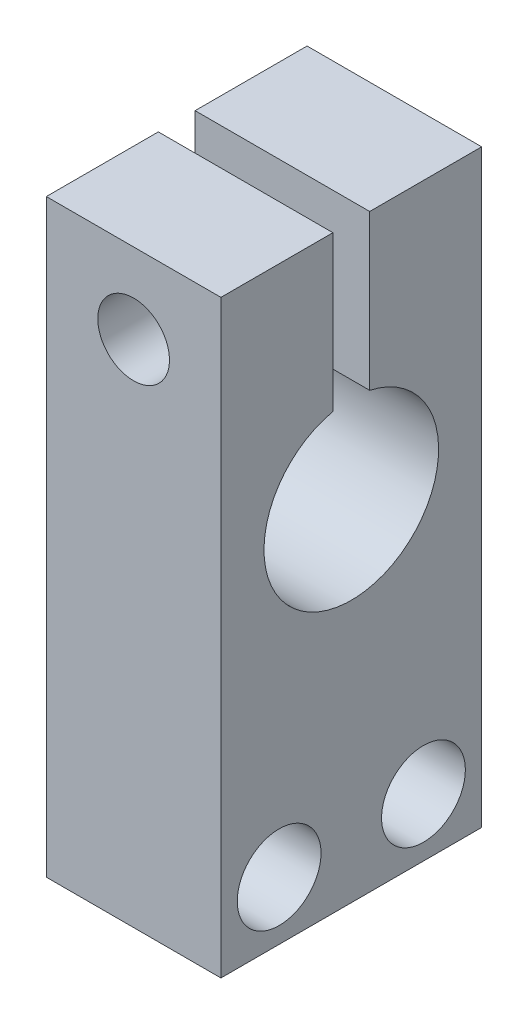
ISO-10303-21;
HEADER;
FILE_DESCRIPTION(('STEP AP214'),'2;1');
FILE_NAME('part.step','',(''),(''),'','','');
FILE_SCHEMA(('AUTOMOTIVE_DESIGN { 1 0 10303 214 1 1 1 1 }'));
ENDSEC;
DATA;
#1=APPLICATION_CONTEXT('core data for automotive mechanical design processes');
#2=APPLICATION_PROTOCOL_DEFINITION('international standard','automotive_design',2000,#1);
#3=PRODUCT_CONTEXT('',#1,'mechanical');
#4=PRODUCT('Part','Part','',(#3));
#5=PRODUCT_RELATED_PRODUCT_CATEGORY('part','',(#4));
#6=PRODUCT_DEFINITION_FORMATION('','',#4);
#7=PRODUCT_DEFINITION_CONTEXT('part definition',#1,'design');
#8=PRODUCT_DEFINITION('design','',#6,#7);
#9=PRODUCT_DEFINITION_SHAPE('','',#8);
#10=(LENGTH_UNIT() NAMED_UNIT(*) SI_UNIT(.MILLI.,.METRE.));
#11=(NAMED_UNIT(*) PLANE_ANGLE_UNIT() SI_UNIT($,.RADIAN.));
#12=(NAMED_UNIT(*) SI_UNIT($,.STERADIAN.) SOLID_ANGLE_UNIT());
#13=UNCERTAINTY_MEASURE_WITH_UNIT(LENGTH_MEASURE(1.E-05),#10,'distance_accuracy_value','');
#14=(GEOMETRIC_REPRESENTATION_CONTEXT(3) GLOBAL_UNCERTAINTY_ASSIGNED_CONTEXT((#13)) GLOBAL_UNIT_ASSIGNED_CONTEXT((#10,
#11,#12)) REPRESENTATION_CONTEXT('',''));
#15=CARTESIAN_POINT('',(0.,0.,0.));
#16=DIRECTION('',(0.,0.,1.));
#17=DIRECTION('',(1.,0.,0.));
#18=AXIS2_PLACEMENT_3D('',#15,#16,#17);
#19=CARTESIAN_POINT('',(-4.7625,13.1064,-15.875));
#20=DIRECTION('',(0.,1.,0.));
#21=DIRECTION('',(0.,0.,1.));
#22=AXIS2_PLACEMENT_3D('',#19,#20,#21);
#23=PLANE('',#22);
#24=DIRECTION('',(-1.,0.,0.));
#25=VECTOR('',#24,1.);
#26=CARTESIAN_POINT('',(4.7625,13.1064,7.112));
#27=LINE('',#26,#25);
#28=CARTESIAN_POINT('',(4.7625,13.1064,7.112));
#29=VERTEX_POINT('',#28);
#30=CARTESIAN_POINT('',(-4.7625,13.1064,7.112));
#31=VERTEX_POINT('',#30);
#32=EDGE_CURVE('E200',#29,#31,#27,.T.);
#33=ORIENTED_EDGE('',*,*,#32,.F.);
#34=DIRECTION('',(0.,0.,1.));
#35=VECTOR('',#34,1.);
#36=CARTESIAN_POINT('',(4.7625,13.1064,-15.875));
#37=LINE('',#36,#35);
#38=CARTESIAN_POINT('',(4.7625,13.1064,1.0033));
#39=VERTEX_POINT('',#38);
#40=EDGE_CURVE('E170',#39,#29,#37,.T.);
#41=ORIENTED_EDGE('',*,*,#40,.F.);
#42=DIRECTION('',(-1.,0.,0.));
#43=VECTOR('',#42,1.);
#44=CARTESIAN_POINT('',(4.7625,13.1064,1.0033));
#45=LINE('',#44,#43);
#46=CARTESIAN_POINT('',(-4.7625,13.1064,1.0033));
#47=VERTEX_POINT('',#46);
#48=EDGE_CURVE('E129',#39,#47,#45,.T.);
#49=ORIENTED_EDGE('',*,*,#48,.T.);
#50=DIRECTION('',(0.,0.,1.));
#51=VECTOR('',#50,1.);
#52=CARTESIAN_POINT('',(-4.7625,13.1064,-15.875));
#53=LINE('',#52,#51);
#54=EDGE_CURVE('E48',#47,#31,#53,.T.);
#55=ORIENTED_EDGE('',*,*,#54,.T.);
#56=EDGE_LOOP('',(#33,#41,#49,#55));
#57=FACE_BOUND('',#56,.T.);
#58=ADVANCED_FACE('F38',(#57),#23,.T.);
#59=CARTESIAN_POINT('',(-4.7625,-19.05,15.875));
#60=DIRECTION('',(0.,-1.,0.));
#61=DIRECTION('',(0.,0.,-1.));
#62=AXIS2_PLACEMENT_3D('',#59,#60,#61);
#63=PLANE('',#62);
#64=DIRECTION('',(1.,0.,0.));
#65=VECTOR('',#64,1.);
#66=CARTESIAN_POINT('',(-4.7625,-19.05,7.112));
#67=LINE('',#66,#65);
#68=CARTESIAN_POINT('',(-4.7625,-19.05,7.112));
#69=VERTEX_POINT('',#68);
#70=CARTESIAN_POINT('',(4.7625,-19.05,7.112));
#71=VERTEX_POINT('',#70);
#72=EDGE_CURVE('E56',#69,#71,#67,.T.);
#73=ORIENTED_EDGE('',*,*,#72,.F.);
#74=DIRECTION('',(0.,0.,-1.));
#75=VECTOR('',#74,1.);
#76=CARTESIAN_POINT('',(-4.7625,-19.05,15.875));
#77=LINE('',#76,#75);
#78=CARTESIAN_POINT('',(-4.7625,-19.05,-7.112));
#79=VERTEX_POINT('',#78);
#80=EDGE_CURVE('E167',#69,#79,#77,.T.);
#81=ORIENTED_EDGE('',*,*,#80,.T.);
#82=DIRECTION('',(-1.,0.,0.));
#83=VECTOR('',#82,1.);
#84=CARTESIAN_POINT('',(4.7625,-19.05,-7.112));
#85=LINE('',#84,#83);
#86=CARTESIAN_POINT('',(4.7625,-19.05,-7.112));
#87=VERTEX_POINT('',#86);
#88=EDGE_CURVE('E156',#87,#79,#85,.T.);
#89=ORIENTED_EDGE('',*,*,#88,.F.);
#90=DIRECTION('',(0.,0.,-1.));
#91=VECTOR('',#90,1.);
#92=CARTESIAN_POINT('',(4.7625,-19.05,15.875));
#93=LINE('',#92,#91);
#94=EDGE_CURVE('E163',#71,#87,#93,.T.);
#95=ORIENTED_EDGE('',*,*,#94,.F.);
#96=EDGE_LOOP('',(#73,#81,#89,#95));
#97=FACE_BOUND('',#96,.T.);
#98=ADVANCED_FACE('F40',(#97),#63,.T.);
#99=DIRECTION('',(-1.,0.,0.));
#100=VECTOR('',#99,1.);
#101=CARTESIAN_POINT('',(4.7625,13.1064,-1.0033));
#102=LINE('',#101,#100);
#103=CARTESIAN_POINT('',(4.7625,13.1064,-1.0033));
#104=VERTEX_POINT('',#103);
#105=CARTESIAN_POINT('',(-4.7625,13.1064,-1.0033));
#106=VERTEX_POINT('',#105);
#107=EDGE_CURVE('E147',#104,#106,#102,.T.);
#108=ORIENTED_EDGE('',*,*,#107,.F.);
#109=CARTESIAN_POINT('',(4.7625,13.1064,-7.112));
#110=VERTEX_POINT('',#109);
#111=EDGE_CURVE('E42',#110,#104,#37,.T.);
#112=ORIENTED_EDGE('',*,*,#111,.F.);
#113=DIRECTION('',(-1.,0.,0.));
#114=VECTOR('',#113,1.);
#115=CARTESIAN_POINT('',(4.7625,13.1064,-7.112));
#116=LINE('',#115,#114);
#117=CARTESIAN_POINT('',(-4.7625,13.1064,-7.112));
#118=VERTEX_POINT('',#117);
#119=EDGE_CURVE('E159',#110,#118,#116,.T.);
#120=ORIENTED_EDGE('',*,*,#119,.T.);
#121=EDGE_CURVE('E11',#118,#106,#53,.T.);
#122=ORIENTED_EDGE('',*,*,#121,.T.);
#123=EDGE_LOOP('',(#108,#112,#120,#122));
#124=FACE_BOUND('',#123,.T.);
#125=ADVANCED_FACE('F181',(#124),#23,.T.);
#126=CARTESIAN_POINT('',(-4.7625,0.,0.));
#127=DIRECTION('',(1.,0.,0.));
#128=DIRECTION('',(0.,0.,-1.));
#129=AXIS2_PLACEMENT_3D('',#126,#127,#128);
#130=PLANE('',#129);
#131=CARTESIAN_POINT('',(-4.7625,-15.875,-3.937));
#132=DIRECTION('',(1.,0.,0.));
#133=DIRECTION('',(0.,0.,-1.));
#134=AXIS2_PLACEMENT_3D('',#131,#132,#133);
#135=CIRCLE('',#134,2.286);
#136=CARTESIAN_POINT('',(-4.7625,-15.875,-6.223));
#137=VERTEX_POINT('',#136);
#138=EDGE_CURVE('E275',#137,#137,#135,.T.);
#139=ORIENTED_EDGE('',*,*,#138,.T.);
#140=EDGE_LOOP('',(#139));
#141=FACE_BOUND('',#140,.T.);
#142=CARTESIAN_POINT('',(-4.7625,-15.875,3.937));
#143=DIRECTION('',(1.,0.,0.));
#144=DIRECTION('',(0.,0.,-1.));
#145=AXIS2_PLACEMENT_3D('',#142,#143,#144);
#146=CIRCLE('',#145,2.286);
#147=CARTESIAN_POINT('',(-4.7625,-15.875,1.651));
#148=VERTEX_POINT('',#147);
#149=EDGE_CURVE('E289',#148,#148,#146,.T.);
#150=ORIENTED_EDGE('',*,*,#149,.T.);
#151=EDGE_LOOP('',(#150));
#152=FACE_BOUND('',#151,.T.);
#153=DIRECTION('',(0.,1.,0.));
#154=VECTOR('',#153,1.);
#155=CARTESIAN_POINT('',(-4.7625,4.65561976110591,1.0033));
#156=LINE('',#155,#154);
#157=CARTESIAN_POINT('',(-4.7625,4.65561976110591,1.0033));
#158=VERTEX_POINT('',#157);
#159=EDGE_CURVE('E138',#158,#47,#156,.T.);
#160=ORIENTED_EDGE('',*,*,#159,.F.);
#161=CARTESIAN_POINT('',(-4.7625,0.,0.));
#162=DIRECTION('',(1.,0.,0.));
#163=DIRECTION('',(0.,0.,-1.));
#164=AXIS2_PLACEMENT_3D('',#161,#162,#163);
#165=CIRCLE('',#164,4.7625);
#166=CARTESIAN_POINT('',(-4.7625,4.65561976110591,-1.0033));
#167=VERTEX_POINT('',#166);
#168=EDGE_CURVE('E107',#158,#167,#165,.T.);
#169=ORIENTED_EDGE('',*,*,#168,.T.);
#170=DIRECTION('',(0.,-1.,0.));
#171=VECTOR('',#170,1.);
#172=CARTESIAN_POINT('',(-4.7625,13.1064,-1.0033));
#173=LINE('',#172,#171);
#174=EDGE_CURVE('E131',#106,#167,#173,.T.);
#175=ORIENTED_EDGE('',*,*,#174,.F.);
#176=ORIENTED_EDGE('',*,*,#121,.F.);
#177=DIRECTION('',(0.,1.,0.));
#178=VECTOR('',#177,1.);
#179=CARTESIAN_POINT('',(-4.7625,-19.05,-7.112));
#180=LINE('',#179,#178);
#181=EDGE_CURVE('E112',#79,#118,#180,.T.);
#182=ORIENTED_EDGE('',*,*,#181,.F.);
#183=ORIENTED_EDGE('',*,*,#80,.F.);
#184=DIRECTION('',(0.,-1.,0.));
#185=VECTOR('',#184,1.);
#186=CARTESIAN_POINT('',(-4.7625,13.1064,7.112));
#187=LINE('',#186,#185);
#188=EDGE_CURVE('E191',#31,#69,#187,.T.);
#189=ORIENTED_EDGE('',*,*,#188,.F.);
#190=ORIENTED_EDGE('',*,*,#54,.F.);
#191=EDGE_LOOP('',(#160,#169,#175,#176,#182,#183,#189,#190));
#192=FACE_BOUND('',#191,.T.);
#193=ADVANCED_FACE('F187',(#141,#152,#192),#130,.F.);
#194=CARTESIAN_POINT('',(4.7625,0.,0.));
#195=DIRECTION('',(1.,0.,0.));
#196=DIRECTION('',(0.,0.,-1.));
#197=AXIS2_PLACEMENT_3D('',#194,#195,#196);
#198=PLANE('',#197);
#199=CARTESIAN_POINT('',(4.7625,-15.875,-3.937));
#200=DIRECTION('',(1.,0.,0.));
#201=DIRECTION('',(0.,0.,-1.));
#202=AXIS2_PLACEMENT_3D('',#199,#200,#201);
#203=CIRCLE('',#202,2.28599999999999);
#204=CARTESIAN_POINT('',(4.7625,-15.875,-6.22299999999999));
#205=VERTEX_POINT('',#204);
#206=EDGE_CURVE('E278',#205,#205,#203,.T.);
#207=ORIENTED_EDGE('',*,*,#206,.F.);
#208=EDGE_LOOP('',(#207));
#209=FACE_BOUND('',#208,.T.);
#210=CARTESIAN_POINT('',(4.7625,-15.875,3.937));
#211=DIRECTION('',(1.,0.,0.));
#212=DIRECTION('',(0.,0.,-1.));
#213=AXIS2_PLACEMENT_3D('',#210,#211,#212);
#214=CIRCLE('',#213,2.28599999999999);
#215=CARTESIAN_POINT('',(4.7625,-15.875,1.65100000000002));
#216=VERTEX_POINT('',#215);
#217=EDGE_CURVE('E283',#216,#216,#214,.T.);
#218=ORIENTED_EDGE('',*,*,#217,.F.);
#219=EDGE_LOOP('',(#218));
#220=FACE_BOUND('',#219,.T.);
#221=CARTESIAN_POINT('',(4.7625,0.,0.));
#222=DIRECTION('',(1.,0.,0.));
#223=DIRECTION('',(0.,0.,-1.));
#224=AXIS2_PLACEMENT_3D('',#221,#222,#223);
#225=CIRCLE('',#224,4.7625);
#226=CARTESIAN_POINT('',(4.7625,4.65561976110591,1.0033));
#227=VERTEX_POINT('',#226);
#228=CARTESIAN_POINT('',(4.7625,4.6556197611059,-1.0033));
#229=VERTEX_POINT('',#228);
#230=EDGE_CURVE('E64',#227,#229,#225,.T.);
#231=ORIENTED_EDGE('',*,*,#230,.F.);
#232=DIRECTION('',(0.,1.,0.));
#233=VECTOR('',#232,1.);
#234=CARTESIAN_POINT('',(4.7625,4.65561976110591,1.0033));
#235=LINE('',#234,#233);
#236=EDGE_CURVE('E120',#227,#39,#235,.T.);
#237=ORIENTED_EDGE('',*,*,#236,.T.);
#238=ORIENTED_EDGE('',*,*,#40,.T.);
#239=DIRECTION('',(0.,-1.,0.));
#240=VECTOR('',#239,1.);
#241=CARTESIAN_POINT('',(4.7625,13.1064,7.112));
#242=LINE('',#241,#240);
#243=EDGE_CURVE('E195',#29,#71,#242,.T.);
#244=ORIENTED_EDGE('',*,*,#243,.T.);
#245=ORIENTED_EDGE('',*,*,#94,.T.);
#246=DIRECTION('',(0.,1.,0.));
#247=VECTOR('',#246,1.);
#248=CARTESIAN_POINT('',(4.7625,-19.05,-7.112));
#249=LINE('',#248,#247);
#250=EDGE_CURVE('E152',#87,#110,#249,.T.);
#251=ORIENTED_EDGE('',*,*,#250,.T.);
#252=ORIENTED_EDGE('',*,*,#111,.T.);
#253=DIRECTION('',(0.,-1.,0.));
#254=VECTOR('',#253,1.);
#255=CARTESIAN_POINT('',(4.7625,13.1064,-1.0033));
#256=LINE('',#255,#254);
#257=EDGE_CURVE('E123',#104,#229,#256,.T.);
#258=ORIENTED_EDGE('',*,*,#257,.T.);
#259=EDGE_LOOP('',(#231,#237,#238,#244,#245,#251,#252,#258));
#260=FACE_BOUND('',#259,.T.);
#261=ADVANCED_FACE('F118',(#209,#220,#260),#198,.T.);
#262=CARTESIAN_POINT('',(4.7625,-19.05,-7.112));
#263=DIRECTION('',(0.,0.,1.));
#264=DIRECTION('',(1.,0.,0.));
#265=AXIS2_PLACEMENT_3D('',#262,#263,#264);
#266=PLANE('',#265);
#267=CARTESIAN_POINT('',(0.,8.7376,-7.112));
#268=DIRECTION('',(0.,0.,-1.));
#269=DIRECTION('',(-1.,0.,0.));
#270=AXIS2_PLACEMENT_3D('',#267,#268,#269);
#271=CIRCLE('',#270,3.56869999999999);
#272=CARTESIAN_POINT('',(-3.56869999999999,8.7376,-7.112));
#273=VERTEX_POINT('',#272);
#274=EDGE_CURVE('E293',#273,#273,#271,.T.);
#275=ORIENTED_EDGE('',*,*,#274,.F.);
#276=EDGE_LOOP('',(#275));
#277=FACE_BOUND('',#276,.T.);
#278=ORIENTED_EDGE('',*,*,#181,.T.);
#279=ORIENTED_EDGE('',*,*,#119,.F.);
#280=ORIENTED_EDGE('',*,*,#250,.F.);
#281=ORIENTED_EDGE('',*,*,#88,.T.);
#282=EDGE_LOOP('',(#278,#279,#280,#281));
#283=FACE_BOUND('',#282,.T.);
#284=ADVANCED_FACE('F232',(#277,#283),#266,.F.);
#285=CARTESIAN_POINT('',(4.7625,4.65561976110591,1.0033));
#286=DIRECTION('',(0.,0.,1.));
#287=DIRECTION('',(1.,0.,0.));
#288=AXIS2_PLACEMENT_3D('',#285,#286,#287);
#289=PLANE('',#288);
#290=CARTESIAN_POINT('',(0.,8.7376,1.0033));
#291=DIRECTION('',(0.,0.,1.));
#292=DIRECTION('',(1.,0.,0.));
#293=AXIS2_PLACEMENT_3D('',#290,#291,#292);
#294=CIRCLE('',#293,1.95580000000001);
#295=CARTESIAN_POINT('',(1.95580000000001,8.7376,1.0033));
#296=VERTEX_POINT('',#295);
#297=EDGE_CURVE('E309',#296,#296,#294,.T.);
#298=ORIENTED_EDGE('',*,*,#297,.T.);
#299=EDGE_LOOP('',(#298));
#300=FACE_BOUND('',#299,.T.);
#301=ORIENTED_EDGE('',*,*,#159,.T.);
#302=ORIENTED_EDGE('',*,*,#48,.F.);
#303=ORIENTED_EDGE('',*,*,#236,.F.);
#304=DIRECTION('',(-1.,0.,0.));
#305=VECTOR('',#304,1.);
#306=CARTESIAN_POINT('',(4.7625,4.65561976110591,1.0033));
#307=LINE('',#306,#305);
#308=EDGE_CURVE('E104',#227,#158,#307,.T.);
#309=ORIENTED_EDGE('',*,*,#308,.T.);
#310=EDGE_LOOP('',(#301,#302,#303,#309));
#311=FACE_BOUND('',#310,.T.);
#312=ADVANCED_FACE('F127',(#300,#311),#289,.F.);
#313=CARTESIAN_POINT('',(4.7625,13.1064,-1.0033));
#314=DIRECTION('',(0.,0.,-1.));
#315=DIRECTION('',(-1.,0.,0.));
#316=AXIS2_PLACEMENT_3D('',#313,#314,#315);
#317=PLANE('',#316);
#318=CARTESIAN_POINT('',(0.,8.7376,-1.0033));
#319=DIRECTION('',(0.,0.,-1.));
#320=DIRECTION('',(-1.,0.,0.));
#321=AXIS2_PLACEMENT_3D('',#318,#319,#320);
#322=CIRCLE('',#321,1.95580000000001);
#323=CARTESIAN_POINT('',(-1.95580000000001,8.7376,-1.0033));
#324=VERTEX_POINT('',#323);
#325=EDGE_CURVE('E125',#324,#324,#322,.T.);
#326=ORIENTED_EDGE('',*,*,#325,.T.);
#327=EDGE_LOOP('',(#326));
#328=FACE_BOUND('',#327,.T.);
#329=ORIENTED_EDGE('',*,*,#174,.T.);
#330=DIRECTION('',(-1.,0.,0.));
#331=VECTOR('',#330,1.);
#332=CARTESIAN_POINT('',(4.7625,4.6556197611059,-1.0033));
#333=LINE('',#332,#331);
#334=EDGE_CURVE('E113',#229,#167,#333,.T.);
#335=ORIENTED_EDGE('',*,*,#334,.F.);
#336=ORIENTED_EDGE('',*,*,#257,.F.);
#337=ORIENTED_EDGE('',*,*,#107,.T.);
#338=EDGE_LOOP('',(#329,#335,#336,#337));
#339=FACE_BOUND('',#338,.T.);
#340=ADVANCED_FACE('F185',(#328,#339),#317,.F.);
#341=CARTESIAN_POINT('',(4.7625,13.1064,7.112));
#342=DIRECTION('',(0.,0.,-1.));
#343=DIRECTION('',(0.,1.,0.));
#344=AXIS2_PLACEMENT_3D('',#341,#342,#343);
#345=PLANE('',#344);
#346=CARTESIAN_POINT('',(0.,8.7376,7.112));
#347=DIRECTION('',(0.,0.,-1.));
#348=DIRECTION('',(-1.,0.,0.));
#349=AXIS2_PLACEMENT_3D('',#346,#347,#348);
#350=CIRCLE('',#349,1.9558);
#351=CARTESIAN_POINT('',(-1.9558,8.7376,7.112));
#352=VERTEX_POINT('',#351);
#353=EDGE_CURVE('E305',#352,#352,#350,.T.);
#354=ORIENTED_EDGE('',*,*,#353,.T.);
#355=EDGE_LOOP('',(#354));
#356=FACE_BOUND('',#355,.T.);
#357=ORIENTED_EDGE('',*,*,#72,.T.);
#358=ORIENTED_EDGE('',*,*,#243,.F.);
#359=ORIENTED_EDGE('',*,*,#32,.T.);
#360=ORIENTED_EDGE('',*,*,#188,.T.);
#361=EDGE_LOOP('',(#357,#358,#359,#360));
#362=FACE_BOUND('',#361,.T.);
#363=ADVANCED_FACE('F209',(#356,#362),#345,.F.);
#364=CARTESIAN_POINT('',(-4.7625,0.,0.));
#365=DIRECTION('',(1.,0.,0.));
#366=DIRECTION('',(0.,0.,-1.));
#367=AXIS2_PLACEMENT_3D('',#364,#365,#366);
#368=CYLINDRICAL_SURFACE('',#367,4.7625);
#369=ORIENTED_EDGE('',*,*,#230,.T.);
#370=ORIENTED_EDGE('',*,*,#334,.T.);
#371=ORIENTED_EDGE('',*,*,#168,.F.);
#372=ORIENTED_EDGE('',*,*,#308,.F.);
#373=EDGE_LOOP('',(#369,#370,#371,#372));
#374=FACE_BOUND('',#373,.T.);
#375=ADVANCED_FACE('F105',(#374),#368,.F.);
#376=CARTESIAN_POINT('',(0.,8.7376,-7.112));
#377=DIRECTION('',(0.,0.,-1.));
#378=DIRECTION('',(-1.,0.,0.));
#379=AXIS2_PLACEMENT_3D('',#376,#377,#378);
#380=CYLINDRICAL_SURFACE('',#379,1.95580000000001);
#381=ORIENTED_EDGE('',*,*,#353,.F.);
#382=EDGE_LOOP('',(#381));
#383=FACE_BOUND('',#382,.T.);
#384=ORIENTED_EDGE('',*,*,#297,.F.);
#385=EDGE_LOOP('',(#384));
#386=FACE_BOUND('',#385,.T.);
#387=ADVANCED_FACE('F251',(#383,#386),#380,.F.);
#388=CARTESIAN_POINT('',(0.,8.7376,-3.2004));
#389=DIRECTION('',(0.,0.,-1.));
#390=DIRECTION('',(-1.,0.,0.));
#391=AXIS2_PLACEMENT_3D('',#388,#389,#390);
#392=CIRCLE('',#391,1.95580000000001);
#393=CARTESIAN_POINT('',(-1.95580000000001,8.7376,-3.2004));
#394=VERTEX_POINT('',#393);
#395=EDGE_CURVE('E301',#394,#394,#392,.T.);
#396=ORIENTED_EDGE('',*,*,#395,.T.);
#397=EDGE_LOOP('',(#396));
#398=FACE_BOUND('',#397,.T.);
#399=ORIENTED_EDGE('',*,*,#325,.F.);
#400=EDGE_LOOP('',(#399));
#401=FACE_BOUND('',#400,.T.);
#402=ADVANCED_FACE('F252',(#398,#401),#380,.F.);
#403=CARTESIAN_POINT('',(1.95580000000001,8.7376,-3.2004));
#404=DIRECTION('',(0.,0.,1.));
#405=DIRECTION('',(1.,0.,0.));
#406=AXIS2_PLACEMENT_3D('',#403,#404,#405);
#407=PLANE('',#406);
#408=ORIENTED_EDGE('',*,*,#395,.F.);
#409=EDGE_LOOP('',(#408));
#410=FACE_BOUND('',#409,.T.);
#411=CARTESIAN_POINT('',(0.,8.7376,-3.2004));
#412=DIRECTION('',(0.,0.,-1.));
#413=DIRECTION('',(-1.,0.,0.));
#414=AXIS2_PLACEMENT_3D('',#411,#412,#413);
#415=CIRCLE('',#414,3.56869999999999);
#416=CARTESIAN_POINT('',(-3.56869999999999,8.7376,-3.2004));
#417=VERTEX_POINT('',#416);
#418=EDGE_CURVE('E297',#417,#417,#415,.T.);
#419=ORIENTED_EDGE('',*,*,#418,.T.);
#420=EDGE_LOOP('',(#419));
#421=FACE_BOUND('',#420,.T.);
#422=ADVANCED_FACE('F255',(#410,#421),#407,.F.);
#423=CARTESIAN_POINT('',(0.,8.7376,-7.112));
#424=DIRECTION('',(0.,0.,-1.));
#425=DIRECTION('',(-1.,0.,0.));
#426=AXIS2_PLACEMENT_3D('',#423,#424,#425);
#427=CYLINDRICAL_SURFACE('',#426,3.56869999999999);
#428=ORIENTED_EDGE('',*,*,#418,.F.);
#429=EDGE_LOOP('',(#428));
#430=FACE_BOUND('',#429,.T.);
#431=ORIENTED_EDGE('',*,*,#274,.T.);
#432=EDGE_LOOP('',(#431));
#433=FACE_BOUND('',#432,.T.);
#434=ADVANCED_FACE('F259',(#430,#433),#427,.F.);
#435=CARTESIAN_POINT('',(4.7625,-15.875,3.937));
#436=DIRECTION('',(1.,0.,0.));
#437=DIRECTION('',(0.,0.,-1.));
#438=AXIS2_PLACEMENT_3D('',#435,#436,#437);
#439=CYLINDRICAL_SURFACE('',#438,2.28599999999999);
#440=ORIENTED_EDGE('',*,*,#149,.F.);
#441=EDGE_LOOP('',(#440));
#442=FACE_BOUND('',#441,.T.);
#443=ORIENTED_EDGE('',*,*,#217,.T.);
#444=EDGE_LOOP('',(#443));
#445=FACE_BOUND('',#444,.T.);
#446=ADVANCED_FACE('F263',(#442,#445),#439,.F.);
#447=CARTESIAN_POINT('',(4.7625,-15.875,-3.937));
#448=DIRECTION('',(1.,0.,0.));
#449=DIRECTION('',(0.,0.,-1.));
#450=AXIS2_PLACEMENT_3D('',#447,#448,#449);
#451=CYLINDRICAL_SURFACE('',#450,2.28599999999999);
#452=ORIENTED_EDGE('',*,*,#138,.F.);
#453=EDGE_LOOP('',(#452));
#454=FACE_BOUND('',#453,.T.);
#455=ORIENTED_EDGE('',*,*,#206,.T.);
#456=EDGE_LOOP('',(#455));
#457=FACE_BOUND('',#456,.T.);
#458=ADVANCED_FACE('F267',(#454,#457),#451,.F.);
#459=CLOSED_SHELL('',(#58,#98,#125,#193,#261,#284,#312,#340,#363,#375,#387,#402,#422,#434,#446,#458));
#460=MANIFOLD_SOLID_BREP('B2',#459);
#461=ADVANCED_BREP_SHAPE_REPRESENTATION('',(#18,#460),#14);
#462=SHAPE_DEFINITION_REPRESENTATION(#9,#461);
ENDSEC;
END-ISO-10303-21;
